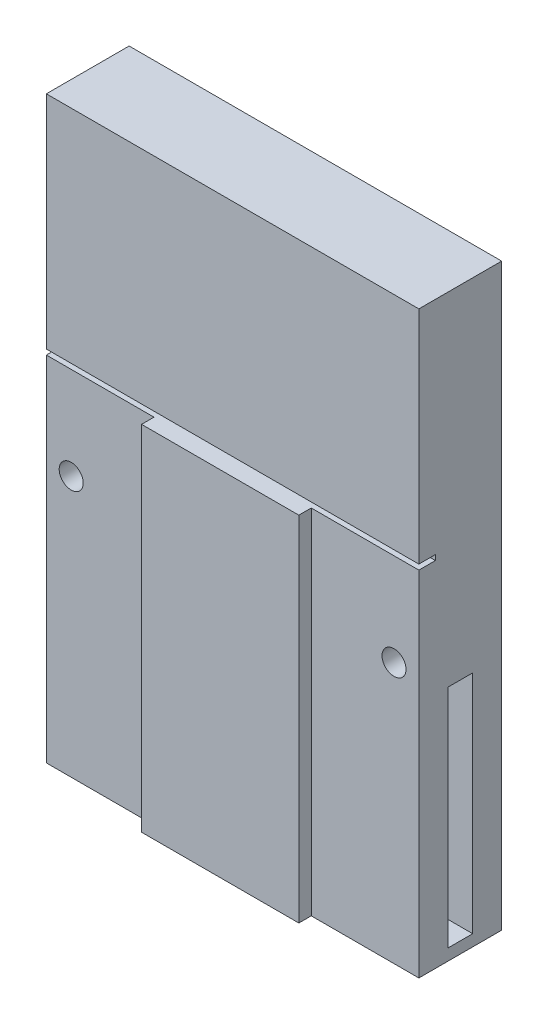
ISO-10303-21;
HEADER;
FILE_DESCRIPTION(('STEP AP214'),'2;1');
FILE_NAME('part.step','',(''),(''),'','','');
FILE_SCHEMA(('AUTOMOTIVE_DESIGN { 1 0 10303 214 1 1 1 1 }'));
ENDSEC;
DATA;
#1=APPLICATION_CONTEXT('core data for automotive mechanical design processes');
#2=APPLICATION_PROTOCOL_DEFINITION('international standard','automotive_design',2000,#1);
#3=PRODUCT_CONTEXT('',#1,'mechanical');
#4=PRODUCT('Part','Part','',(#3));
#5=PRODUCT_RELATED_PRODUCT_CATEGORY('part','',(#4));
#6=PRODUCT_DEFINITION_FORMATION('','',#4);
#7=PRODUCT_DEFINITION_CONTEXT('part definition',#1,'design');
#8=PRODUCT_DEFINITION('design','',#6,#7);
#9=PRODUCT_DEFINITION_SHAPE('','',#8);
#10=(LENGTH_UNIT() NAMED_UNIT(*) SI_UNIT(.MILLI.,.METRE.));
#11=(NAMED_UNIT(*) PLANE_ANGLE_UNIT() SI_UNIT($,.RADIAN.));
#12=(NAMED_UNIT(*) SI_UNIT($,.STERADIAN.) SOLID_ANGLE_UNIT());
#13=UNCERTAINTY_MEASURE_WITH_UNIT(LENGTH_MEASURE(1.E-05),#10,'distance_accuracy_value','');
#14=(GEOMETRIC_REPRESENTATION_CONTEXT(3) GLOBAL_UNCERTAINTY_ASSIGNED_CONTEXT((#13)) GLOBAL_UNIT_ASSIGNED_CONTEXT((#10,
#11,#12)) REPRESENTATION_CONTEXT('',''));
#15=CARTESIAN_POINT('',(0.,0.,0.));
#16=DIRECTION('',(0.,0.,1.));
#17=DIRECTION('',(1.,0.,0.));
#18=AXIS2_PLACEMENT_3D('',#15,#16,#17);
#19=CARTESIAN_POINT('',(-22.5,40.,-4.99999999999999));
#20=DIRECTION('',(1.,0.,0.));
#21=DIRECTION('',(0.,0.,-1.));
#22=AXIS2_PLACEMENT_3D('',#19,#20,#21);
#23=PLANE('',#22);
#24=DIRECTION('',(0.,-1.,0.));
#25=VECTOR('',#24,1.);
#26=CARTESIAN_POINT('',(-22.5,23.2974929319475,3.));
#27=LINE('',#26,#25);
#28=CARTESIAN_POINT('',(-22.5,23.2974929319475,3.));
#29=VERTEX_POINT('',#28);
#30=CARTESIAN_POINT('',(-22.5,22.6713275749144,3.));
#31=VERTEX_POINT('',#30);
#32=EDGE_CURVE('E270',#29,#31,#27,.T.);
#33=ORIENTED_EDGE('',*,*,#32,.F.);
#34=DIRECTION('',(0.,0.,1.));
#35=VECTOR('',#34,1.);
#36=CARTESIAN_POINT('',(-22.5,23.2974929319475,3.));
#37=LINE('',#36,#35);
#38=CARTESIAN_POINT('',(-22.5,23.2974929319475,5.));
#39=VERTEX_POINT('',#38);
#40=EDGE_CURVE('E286',#29,#39,#37,.T.);
#41=ORIENTED_EDGE('',*,*,#40,.T.);
#42=DIRECTION('',(0.,-1.,0.));
#43=VECTOR('',#42,1.);
#44=CARTESIAN_POINT('',(-22.5,40.,5.00000000000001));
#45=LINE('',#44,#43);
#46=CARTESIAN_POINT('',(-22.5,50.,5.));
#47=VERTEX_POINT('',#46);
#48=EDGE_CURVE('E11',#47,#39,#45,.T.);
#49=ORIENTED_EDGE('',*,*,#48,.F.);
#50=DIRECTION('',(0.,0.,1.));
#51=VECTOR('',#50,1.);
#52=CARTESIAN_POINT('',(-22.5,50.,-4.99999999999999));
#53=LINE('',#52,#51);
#54=CARTESIAN_POINT('',(-22.5,50.,-4.99999999999999));
#55=VERTEX_POINT('',#54);
#56=EDGE_CURVE('E315',#55,#47,#53,.T.);
#57=ORIENTED_EDGE('',*,*,#56,.F.);
#58=DIRECTION('',(0.,-1.,0.));
#59=VECTOR('',#58,1.);
#60=CARTESIAN_POINT('',(-22.5,40.,-4.99999999999999));
#61=LINE('',#60,#59);
#62=CARTESIAN_POINT('',(-22.5,-20.,-5.));
#63=VERTEX_POINT('',#62);
#64=EDGE_CURVE('E327',#55,#63,#61,.T.);
#65=ORIENTED_EDGE('',*,*,#64,.T.);
#66=DIRECTION('',(0.,0.,-1.));
#67=VECTOR('',#66,1.);
#68=CARTESIAN_POINT('',(-22.5,-20.,5.00000000000001));
#69=LINE('',#68,#67);
#70=CARTESIAN_POINT('',(-22.5,-20.,5.00000000000001));
#71=VERTEX_POINT('',#70);
#72=EDGE_CURVE('E302',#71,#63,#69,.T.);
#73=ORIENTED_EDGE('',*,*,#72,.F.);
#74=CARTESIAN_POINT('',(-22.5,22.6713275749144,5.));
#75=VERTEX_POINT('',#74);
#76=EDGE_CURVE('E48',#75,#71,#45,.T.);
#77=ORIENTED_EDGE('',*,*,#76,.F.);
#78=DIRECTION('',(0.,0.,1.));
#79=VECTOR('',#78,1.);
#80=CARTESIAN_POINT('',(-22.5,22.6713275749144,3.));
#81=LINE('',#80,#79);
#82=EDGE_CURVE('E281',#31,#75,#81,.T.);
#83=ORIENTED_EDGE('',*,*,#82,.F.);
#84=EDGE_LOOP('',(#33,#41,#49,#57,#65,#73,#77,#83));
#85=FACE_BOUND('',#84,.T.);
#86=DIRECTION('',(0.,-1.,0.));
#87=VECTOR('',#86,1.);
#88=CARTESIAN_POINT('',(-22.5,8.67132757491439,1.5));
#89=LINE('',#88,#87);
#90=CARTESIAN_POINT('',(-22.5,8.67132757491439,1.5));
#91=VERTEX_POINT('',#90);
#92=CARTESIAN_POINT('',(-22.5,-18.6150080325972,1.5));
#93=VERTEX_POINT('',#92);
#94=EDGE_CURVE('E56',#91,#93,#89,.T.);
#95=ORIENTED_EDGE('',*,*,#94,.T.);
#96=DIRECTION('',(0.,0.,-1.));
#97=VECTOR('',#96,1.);
#98=CARTESIAN_POINT('',(-22.5,-18.6150080325972,1.5));
#99=LINE('',#98,#97);
#100=CARTESIAN_POINT('',(-22.5,-18.6150080325972,-1.5));
#101=VERTEX_POINT('',#100);
#102=EDGE_CURVE('E198',#93,#101,#99,.T.);
#103=ORIENTED_EDGE('',*,*,#102,.T.);
#104=DIRECTION('',(0.,1.,0.));
#105=VECTOR('',#104,1.);
#106=CARTESIAN_POINT('',(-22.5,8.67132757491439,-1.5));
#107=LINE('',#106,#105);
#108=CARTESIAN_POINT('',(-22.5,8.67132757491439,-1.5));
#109=VERTEX_POINT('',#108);
#110=EDGE_CURVE('E201',#101,#109,#107,.T.);
#111=ORIENTED_EDGE('',*,*,#110,.T.);
#112=DIRECTION('',(0.,0.,1.));
#113=VECTOR('',#112,1.);
#114=CARTESIAN_POINT('',(-22.5,8.67132757491439,1.5));
#115=LINE('',#114,#113);
#116=EDGE_CURVE('E207',#109,#91,#115,.T.);
#117=ORIENTED_EDGE('',*,*,#116,.T.);
#118=EDGE_LOOP('',(#95,#103,#111,#117));
#119=FACE_BOUND('',#118,.T.);
#120=ADVANCED_FACE('F40',(#85,#119),#23,.F.);
#121=CARTESIAN_POINT('',(22.5,40.,5.));
#122=DIRECTION('',(0.,0.,-1.));
#123=DIRECTION('',(-1.,0.,0.));
#124=AXIS2_PLACEMENT_3D('',#121,#122,#123);
#125=PLANE('',#124);
#126=CARTESIAN_POINT('',(-19.5,11.5,5.));
#127=DIRECTION('',(0.,0.,1.));
#128=DIRECTION('',(1.,0.,0.));
#129=AXIS2_PLACEMENT_3D('',#126,#127,#128);
#130=CIRCLE('',#129,1.45);
#131=CARTESIAN_POINT('',(-18.05,11.5,5.));
#132=VERTEX_POINT('',#131);
#133=EDGE_CURVE('E289',#132,#132,#130,.T.);
#134=ORIENTED_EDGE('',*,*,#133,.F.);
#135=EDGE_LOOP('',(#134));
#136=FACE_BOUND('',#135,.T.);
#137=DIRECTION('',(0.,-1.,0.));
#138=VECTOR('',#137,1.);
#139=CARTESIAN_POINT('',(-9.50000000000001,22.6713275749144,5.));
#140=LINE('',#139,#138);
#141=CARTESIAN_POINT('',(-9.50000000000001,22.6713275749144,5.));
#142=VERTEX_POINT('',#141);
#143=CARTESIAN_POINT('',(-9.5,-20.,5.));
#144=VERTEX_POINT('',#143);
#145=EDGE_CURVE('E241',#142,#144,#140,.T.);
#146=ORIENTED_EDGE('',*,*,#145,.F.);
#147=DIRECTION('',(1.,0.,0.));
#148=VECTOR('',#147,1.);
#149=CARTESIAN_POINT('',(-22.5,22.6713275749144,5.));
#150=LINE('',#149,#148);
#151=EDGE_CURVE('E282',#75,#142,#150,.T.);
#152=ORIENTED_EDGE('',*,*,#151,.F.);
#153=ORIENTED_EDGE('',*,*,#76,.T.);
#154=DIRECTION('',(-1.,0.,0.));
#155=VECTOR('',#154,1.);
#156=CARTESIAN_POINT('',(-22.5,-20.,5.00000000000001));
#157=LINE('',#156,#155);
#158=EDGE_CURVE('E311',#144,#71,#157,.T.);
#159=ORIENTED_EDGE('',*,*,#158,.F.);
#160=EDGE_LOOP('',(#146,#152,#153,#159));
#161=FACE_BOUND('',#160,.T.);
#162=ADVANCED_FACE('F361',(#136,#161),#125,.F.);
#163=CARTESIAN_POINT('',(19.5,11.5,5.));
#164=DIRECTION('',(0.,0.,1.));
#165=DIRECTION('',(1.,0.,0.));
#166=AXIS2_PLACEMENT_3D('',#163,#164,#165);
#167=CIRCLE('',#166,1.45);
#168=CARTESIAN_POINT('',(20.95,11.5,5.));
#169=VERTEX_POINT('',#168);
#170=EDGE_CURVE('E296',#169,#169,#167,.T.);
#171=ORIENTED_EDGE('',*,*,#170,.F.);
#172=EDGE_LOOP('',(#171));
#173=FACE_BOUND('',#172,.T.);
#174=DIRECTION('',(0.,1.,0.));
#175=VECTOR('',#174,1.);
#176=CARTESIAN_POINT('',(9.49999999999999,22.6713275749144,5.));
#177=LINE('',#176,#175);
#178=CARTESIAN_POINT('',(9.5,-20.,5.));
#179=VERTEX_POINT('',#178);
#180=CARTESIAN_POINT('',(9.49999999999998,22.6713275749144,5.));
#181=VERTEX_POINT('',#180);
#182=EDGE_CURVE('E251',#179,#181,#177,.T.);
#183=ORIENTED_EDGE('',*,*,#182,.F.);
#184=CARTESIAN_POINT('',(22.5,-20.,5.00000000000001));
#185=VERTEX_POINT('',#184);
#186=EDGE_CURVE('E312',#185,#179,#157,.T.);
#187=ORIENTED_EDGE('',*,*,#186,.F.);
#188=DIRECTION('',(0.,-1.,0.));
#189=VECTOR('',#188,1.);
#190=CARTESIAN_POINT('',(22.5,40.,5.));
#191=LINE('',#190,#189);
#192=CARTESIAN_POINT('',(22.5,22.6713275749144,5.));
#193=VERTEX_POINT('',#192);
#194=EDGE_CURVE('E331',#193,#185,#191,.T.);
#195=ORIENTED_EDGE('',*,*,#194,.F.);
#196=EDGE_CURVE('E269',#181,#193,#150,.T.);
#197=ORIENTED_EDGE('',*,*,#196,.F.);
#198=EDGE_LOOP('',(#183,#187,#195,#197));
#199=FACE_BOUND('',#198,.T.);
#200=ADVANCED_FACE('F368',(#173,#199),#125,.F.);
#201=ORIENTED_EDGE('',*,*,#48,.T.);
#202=DIRECTION('',(-1.,0.,0.));
#203=VECTOR('',#202,1.);
#204=CARTESIAN_POINT('',(-22.5,23.2974929319475,5.));
#205=LINE('',#204,#203);
#206=CARTESIAN_POINT('',(22.5,23.2974929319475,5.));
#207=VERTEX_POINT('',#206);
#208=EDGE_CURVE('E274',#207,#39,#205,.T.);
#209=ORIENTED_EDGE('',*,*,#208,.F.);
#210=CARTESIAN_POINT('',(22.5,50.,5.));
#211=VERTEX_POINT('',#210);
#212=EDGE_CURVE('E332',#211,#207,#191,.T.);
#213=ORIENTED_EDGE('',*,*,#212,.F.);
#214=DIRECTION('',(1.,0.,0.));
#215=VECTOR('',#214,1.);
#216=CARTESIAN_POINT('',(-22.5,50.,5.));
#217=LINE('',#216,#215);
#218=EDGE_CURVE('E318',#47,#211,#217,.T.);
#219=ORIENTED_EDGE('',*,*,#218,.F.);
#220=EDGE_LOOP('',(#201,#209,#213,#219));
#221=FACE_BOUND('',#220,.T.);
#222=ADVANCED_FACE('F370',(#221),#125,.F.);
#223=CARTESIAN_POINT('',(22.5,40.,-5.));
#224=DIRECTION('',(-1.,0.,0.));
#225=DIRECTION('',(0.,0.,1.));
#226=AXIS2_PLACEMENT_3D('',#223,#224,#225);
#227=PLANE('',#226);
#228=DIRECTION('',(0.,0.,-1.));
#229=VECTOR('',#228,1.);
#230=CARTESIAN_POINT('',(22.5,-18.6150080325972,1.5));
#231=LINE('',#230,#229);
#232=CARTESIAN_POINT('',(22.5,-18.6150080325973,1.5));
#233=VERTEX_POINT('',#232);
#234=CARTESIAN_POINT('',(22.5,-18.6150080325972,-1.5));
#235=VERTEX_POINT('',#234);
#236=EDGE_CURVE('E231',#233,#235,#231,.T.);
#237=ORIENTED_EDGE('',*,*,#236,.F.);
#238=DIRECTION('',(0.,-1.,0.));
#239=VECTOR('',#238,1.);
#240=CARTESIAN_POINT('',(22.5,8.67132757491439,1.5));
#241=LINE('',#240,#239);
#242=CARTESIAN_POINT('',(22.5,8.67132757491439,1.5));
#243=VERTEX_POINT('',#242);
#244=EDGE_CURVE('E64',#243,#233,#241,.T.);
#245=ORIENTED_EDGE('',*,*,#244,.F.);
#246=DIRECTION('',(0.,0.,1.));
#247=VECTOR('',#246,1.);
#248=CARTESIAN_POINT('',(22.5,8.67132757491439,1.5));
#249=LINE('',#248,#247);
#250=CARTESIAN_POINT('',(22.5,8.67132757491439,-1.5));
#251=VERTEX_POINT('',#250);
#252=EDGE_CURVE('E220',#251,#243,#249,.T.);
#253=ORIENTED_EDGE('',*,*,#252,.F.);
#254=DIRECTION('',(0.,1.,0.));
#255=VECTOR('',#254,1.);
#256=CARTESIAN_POINT('',(22.5,8.67132757491439,-1.5));
#257=LINE('',#256,#255);
#258=EDGE_CURVE('E234',#235,#251,#257,.T.);
#259=ORIENTED_EDGE('',*,*,#258,.F.);
#260=EDGE_LOOP('',(#237,#245,#253,#259));
#261=FACE_BOUND('',#260,.T.);
#262=ORIENTED_EDGE('',*,*,#212,.T.);
#263=DIRECTION('',(0.,0.,1.));
#264=VECTOR('',#263,1.);
#265=CARTESIAN_POINT('',(22.5,23.2974929319475,3.));
#266=LINE('',#265,#264);
#267=CARTESIAN_POINT('',(22.5,23.2974929319475,3.));
#268=VERTEX_POINT('',#267);
#269=EDGE_CURVE('E290',#268,#207,#266,.T.);
#270=ORIENTED_EDGE('',*,*,#269,.F.);
#271=DIRECTION('',(0.,1.,0.));
#272=VECTOR('',#271,1.);
#273=CARTESIAN_POINT('',(22.5,23.2974929319475,3.));
#274=LINE('',#273,#272);
#275=CARTESIAN_POINT('',(22.5,22.6713275749144,3.));
#276=VERTEX_POINT('',#275);
#277=EDGE_CURVE('E276',#276,#268,#274,.T.);
#278=ORIENTED_EDGE('',*,*,#277,.F.);
#279=DIRECTION('',(0.,0.,1.));
#280=VECTOR('',#279,1.);
#281=CARTESIAN_POINT('',(22.5,22.6713275749144,3.));
#282=LINE('',#281,#280);
#283=EDGE_CURVE('E292',#276,#193,#282,.T.);
#284=ORIENTED_EDGE('',*,*,#283,.T.);
#285=ORIENTED_EDGE('',*,*,#194,.T.);
#286=DIRECTION('',(0.,0.,1.));
#287=VECTOR('',#286,1.);
#288=CARTESIAN_POINT('',(22.5,-20.,5.00000000000001));
#289=LINE('',#288,#287);
#290=CARTESIAN_POINT('',(22.5,-20.,-5.));
#291=VERTEX_POINT('',#290);
#292=EDGE_CURVE('E308',#291,#185,#289,.T.);
#293=ORIENTED_EDGE('',*,*,#292,.F.);
#294=DIRECTION('',(0.,-1.,0.));
#295=VECTOR('',#294,1.);
#296=CARTESIAN_POINT('',(22.5,40.,-5.));
#297=LINE('',#296,#295);
#298=CARTESIAN_POINT('',(22.5,50.,-4.99999999999999));
#299=VERTEX_POINT('',#298);
#300=EDGE_CURVE('E329',#299,#291,#297,.T.);
#301=ORIENTED_EDGE('',*,*,#300,.F.);
#302=DIRECTION('',(0.,0.,-1.));
#303=VECTOR('',#302,1.);
#304=CARTESIAN_POINT('',(22.5,50.,-4.99999999999999));
#305=LINE('',#304,#303);
#306=EDGE_CURVE('E321',#211,#299,#305,.T.);
#307=ORIENTED_EDGE('',*,*,#306,.F.);
#308=EDGE_LOOP('',(#262,#270,#278,#284,#285,#293,#301,#307));
#309=FACE_BOUND('',#308,.T.);
#310=ADVANCED_FACE('F454',(#261,#309),#227,.F.);
#311=CARTESIAN_POINT('',(22.5,40.,-5.));
#312=DIRECTION('',(0.,0.,1.));
#313=DIRECTION('',(1.,0.,0.));
#314=AXIS2_PLACEMENT_3D('',#311,#312,#313);
#315=PLANE('',#314);
#316=CARTESIAN_POINT('',(19.5,11.5,-5.));
#317=DIRECTION('',(0.,0.,1.));
#318=DIRECTION('',(1.,0.,0.));
#319=AXIS2_PLACEMENT_3D('',#316,#317,#318);
#320=CIRCLE('',#319,1.45);
#321=CARTESIAN_POINT('',(20.95,11.5,-5.));
#322=VERTEX_POINT('',#321);
#323=EDGE_CURVE('E43',#322,#322,#320,.T.);
#324=ORIENTED_EDGE('',*,*,#323,.T.);
#325=EDGE_LOOP('',(#324));
#326=FACE_BOUND('',#325,.T.);
#327=CARTESIAN_POINT('',(-19.5,11.5,-4.99999999999999));
#328=DIRECTION('',(0.,0.,1.));
#329=DIRECTION('',(1.,0.,0.));
#330=AXIS2_PLACEMENT_3D('',#327,#328,#329);
#331=CIRCLE('',#330,1.45);
#332=CARTESIAN_POINT('',(-18.05,11.5,-4.99999999999999));
#333=VERTEX_POINT('',#332);
#334=EDGE_CURVE('E299',#333,#333,#331,.T.);
#335=ORIENTED_EDGE('',*,*,#334,.T.);
#336=EDGE_LOOP('',(#335));
#337=FACE_BOUND('',#336,.T.);
#338=ORIENTED_EDGE('',*,*,#300,.T.);
#339=DIRECTION('',(1.,0.,0.));
#340=VECTOR('',#339,1.);
#341=CARTESIAN_POINT('',(-22.5,-20.,-5.));
#342=LINE('',#341,#340);
#343=EDGE_CURVE('E305',#63,#291,#342,.T.);
#344=ORIENTED_EDGE('',*,*,#343,.F.);
#345=ORIENTED_EDGE('',*,*,#64,.F.);
#346=DIRECTION('',(-1.,0.,0.));
#347=VECTOR('',#346,1.);
#348=CARTESIAN_POINT('',(-22.5,50.,-4.99999999999999));
#349=LINE('',#348,#347);
#350=EDGE_CURVE('E324',#299,#55,#349,.T.);
#351=ORIENTED_EDGE('',*,*,#350,.F.);
#352=EDGE_LOOP('',(#338,#344,#345,#351));
#353=FACE_BOUND('',#352,.T.);
#354=ADVANCED_FACE('F340',(#326,#337,#353),#315,.F.);
#355=CARTESIAN_POINT('',(0.,50.,0.));
#356=DIRECTION('',(0.,1.,0.));
#357=DIRECTION('',(0.,0.,1.));
#358=AXIS2_PLACEMENT_3D('',#355,#356,#357);
#359=PLANE('',#358);
#360=ORIENTED_EDGE('',*,*,#56,.T.);
#361=ORIENTED_EDGE('',*,*,#218,.T.);
#362=ORIENTED_EDGE('',*,*,#306,.T.);
#363=ORIENTED_EDGE('',*,*,#350,.T.);
#364=EDGE_LOOP('',(#360,#361,#362,#363));
#365=FACE_BOUND('',#364,.T.);
#366=ADVANCED_FACE('F463',(#365),#359,.T.);
#367=CARTESIAN_POINT('',(0.,-20.,0.));
#368=DIRECTION('',(0.,-1.,0.));
#369=DIRECTION('',(0.,0.,-1.));
#370=AXIS2_PLACEMENT_3D('',#367,#368,#369);
#371=PLANE('',#370);
#372=ORIENTED_EDGE('',*,*,#72,.T.);
#373=ORIENTED_EDGE('',*,*,#343,.T.);
#374=ORIENTED_EDGE('',*,*,#292,.T.);
#375=ORIENTED_EDGE('',*,*,#186,.T.);
#376=DIRECTION('',(0.,0.,-1.));
#377=VECTOR('',#376,1.);
#378=CARTESIAN_POINT('',(9.5,-20.,6.5));
#379=LINE('',#378,#377);
#380=CARTESIAN_POINT('',(9.5,-20.,6.5));
#381=VERTEX_POINT('',#380);
#382=EDGE_CURVE('E265',#381,#179,#379,.T.);
#383=ORIENTED_EDGE('',*,*,#382,.F.);
#384=DIRECTION('',(1.,0.,0.));
#385=VECTOR('',#384,1.);
#386=CARTESIAN_POINT('',(-9.5,-20.,6.5));
#387=LINE('',#386,#385);
#388=CARTESIAN_POINT('',(-9.5,-20.,6.5));
#389=VERTEX_POINT('',#388);
#390=EDGE_CURVE('E250',#389,#381,#387,.T.);
#391=ORIENTED_EDGE('',*,*,#390,.F.);
#392=DIRECTION('',(0.,0.,-1.));
#393=VECTOR('',#392,1.);
#394=CARTESIAN_POINT('',(-9.5,-20.,6.5));
#395=LINE('',#394,#393);
#396=EDGE_CURVE('E267',#389,#144,#395,.T.);
#397=ORIENTED_EDGE('',*,*,#396,.T.);
#398=ORIENTED_EDGE('',*,*,#158,.T.);
#399=EDGE_LOOP('',(#372,#373,#374,#375,#383,#391,#397,#398));
#400=FACE_BOUND('',#399,.T.);
#401=ADVANCED_FACE('F356',(#400),#371,.T.);
#402=CARTESIAN_POINT('',(-19.5,11.5,-15.));
#403=DIRECTION('',(0.,0.,1.));
#404=DIRECTION('',(1.,0.,0.));
#405=AXIS2_PLACEMENT_3D('',#402,#403,#404);
#406=CYLINDRICAL_SURFACE('',#405,1.45);
#407=ORIENTED_EDGE('',*,*,#133,.T.);
#408=EDGE_LOOP('',(#407));
#409=FACE_BOUND('',#408,.T.);
#410=ORIENTED_EDGE('',*,*,#334,.F.);
#411=EDGE_LOOP('',(#410));
#412=FACE_BOUND('',#411,.T.);
#413=ADVANCED_FACE('F345',(#409,#412),#406,.F.);
#414=CARTESIAN_POINT('',(19.5,11.5,-15.));
#415=DIRECTION('',(0.,0.,1.));
#416=DIRECTION('',(1.,0.,0.));
#417=AXIS2_PLACEMENT_3D('',#414,#415,#416);
#418=CYLINDRICAL_SURFACE('',#417,1.45);
#419=ORIENTED_EDGE('',*,*,#170,.T.);
#420=EDGE_LOOP('',(#419));
#421=FACE_BOUND('',#420,.T.);
#422=ORIENTED_EDGE('',*,*,#323,.F.);
#423=EDGE_LOOP('',(#422));
#424=FACE_BOUND('',#423,.T.);
#425=ADVANCED_FACE('F342',(#421,#424),#418,.F.);
#426=CARTESIAN_POINT('',(-22.5,23.2974929319475,3.));
#427=DIRECTION('',(0.,1.,0.));
#428=DIRECTION('',(0.,0.,1.));
#429=AXIS2_PLACEMENT_3D('',#426,#427,#428);
#430=PLANE('',#429);
#431=ORIENTED_EDGE('',*,*,#208,.T.);
#432=ORIENTED_EDGE('',*,*,#40,.F.);
#433=DIRECTION('',(-1.,0.,0.));
#434=VECTOR('',#433,1.);
#435=CARTESIAN_POINT('',(-22.5,23.2974929319475,3.));
#436=LINE('',#435,#434);
#437=EDGE_CURVE('E278',#268,#29,#436,.T.);
#438=ORIENTED_EDGE('',*,*,#437,.F.);
#439=ORIENTED_EDGE('',*,*,#269,.T.);
#440=EDGE_LOOP('',(#431,#432,#438,#439));
#441=FACE_BOUND('',#440,.T.);
#442=ADVANCED_FACE('F344',(#441),#430,.F.);
#443=CARTESIAN_POINT('',(-22.5,22.6713275749144,3.));
#444=DIRECTION('',(0.,-1.,0.));
#445=DIRECTION('',(0.,0.,-1.));
#446=AXIS2_PLACEMENT_3D('',#443,#444,#445);
#447=PLANE('',#446);
#448=ORIENTED_EDGE('',*,*,#151,.T.);
#449=DIRECTION('',(0.,0.,-1.));
#450=VECTOR('',#449,1.);
#451=CARTESIAN_POINT('',(-9.50000000000001,22.6713275749144,6.5));
#452=LINE('',#451,#450);
#453=CARTESIAN_POINT('',(-9.50000000000001,22.6713275749144,6.5));
#454=VERTEX_POINT('',#453);
#455=EDGE_CURVE('E257',#454,#142,#452,.T.);
#456=ORIENTED_EDGE('',*,*,#455,.F.);
#457=DIRECTION('',(-1.,0.,0.));
#458=VECTOR('',#457,1.);
#459=CARTESIAN_POINT('',(-9.50000000000001,22.6713275749144,6.5));
#460=LINE('',#459,#458);
#461=CARTESIAN_POINT('',(9.49999999999999,22.6713275749144,6.5));
#462=VERTEX_POINT('',#461);
#463=EDGE_CURVE('E255',#462,#454,#460,.T.);
#464=ORIENTED_EDGE('',*,*,#463,.F.);
#465=DIRECTION('',(0.,0.,-1.));
#466=VECTOR('',#465,1.);
#467=CARTESIAN_POINT('',(9.49999999999999,22.6713275749144,6.5));
#468=LINE('',#467,#466);
#469=EDGE_CURVE('E263',#462,#181,#468,.T.);
#470=ORIENTED_EDGE('',*,*,#469,.T.);
#471=ORIENTED_EDGE('',*,*,#196,.T.);
#472=ORIENTED_EDGE('',*,*,#283,.F.);
#473=DIRECTION('',(1.,0.,0.));
#474=VECTOR('',#473,1.);
#475=CARTESIAN_POINT('',(-22.5,22.6713275749144,3.));
#476=LINE('',#475,#474);
#477=EDGE_CURVE('E273',#31,#276,#476,.T.);
#478=ORIENTED_EDGE('',*,*,#477,.F.);
#479=ORIENTED_EDGE('',*,*,#82,.T.);
#480=EDGE_LOOP('',(#448,#456,#464,#470,#471,#472,#478,#479));
#481=FACE_BOUND('',#480,.T.);
#482=ADVANCED_FACE('F353',(#481),#447,.F.);
#483=CARTESIAN_POINT('',(0.,0.,3.));
#484=DIRECTION('',(0.,0.,1.));
#485=DIRECTION('',(1.,0.,0.));
#486=AXIS2_PLACEMENT_3D('',#483,#484,#485);
#487=PLANE('',#486);
#488=ORIENTED_EDGE('',*,*,#32,.T.);
#489=ORIENTED_EDGE('',*,*,#477,.T.);
#490=ORIENTED_EDGE('',*,*,#277,.T.);
#491=ORIENTED_EDGE('',*,*,#437,.T.);
#492=EDGE_LOOP('',(#488,#489,#490,#491));
#493=FACE_BOUND('',#492,.T.);
#494=ADVANCED_FACE('F420',(#493),#487,.T.);
#495=CARTESIAN_POINT('',(-9.50000000000001,22.6713275749144,6.5));
#496=DIRECTION('',(1.,0.,0.));
#497=DIRECTION('',(0.,1.,0.));
#498=AXIS2_PLACEMENT_3D('',#495,#496,#497);
#499=PLANE('',#498);
#500=ORIENTED_EDGE('',*,*,#145,.T.);
#501=ORIENTED_EDGE('',*,*,#396,.F.);
#502=DIRECTION('',(0.,-1.,0.));
#503=VECTOR('',#502,1.);
#504=CARTESIAN_POINT('',(-9.50000000000001,22.6713275749144,6.5));
#505=LINE('',#504,#503);
#506=EDGE_CURVE('E247',#454,#389,#505,.T.);
#507=ORIENTED_EDGE('',*,*,#506,.F.);
#508=ORIENTED_EDGE('',*,*,#455,.T.);
#509=EDGE_LOOP('',(#500,#501,#507,#508));
#510=FACE_BOUND('',#509,.T.);
#511=ADVANCED_FACE('F416',(#510),#499,.F.);
#512=CARTESIAN_POINT('',(9.49999999999999,22.6713275749144,6.5));
#513=DIRECTION('',(-1.,0.,0.));
#514=DIRECTION('',(0.,-1.,0.));
#515=AXIS2_PLACEMENT_3D('',#512,#513,#514);
#516=PLANE('',#515);
#517=ORIENTED_EDGE('',*,*,#182,.T.);
#518=ORIENTED_EDGE('',*,*,#469,.F.);
#519=DIRECTION('',(0.,1.,0.));
#520=VECTOR('',#519,1.);
#521=CARTESIAN_POINT('',(9.49999999999999,22.6713275749144,6.5));
#522=LINE('',#521,#520);
#523=EDGE_CURVE('E253',#381,#462,#522,.T.);
#524=ORIENTED_EDGE('',*,*,#523,.F.);
#525=ORIENTED_EDGE('',*,*,#382,.T.);
#526=EDGE_LOOP('',(#517,#518,#524,#525));
#527=FACE_BOUND('',#526,.T.);
#528=ADVANCED_FACE('F412',(#527),#516,.F.);
#529=CARTESIAN_POINT('',(0.,0.,6.5));
#530=DIRECTION('',(0.,0.,1.));
#531=DIRECTION('',(1.,0.,0.));
#532=AXIS2_PLACEMENT_3D('',#529,#530,#531);
#533=PLANE('',#532);
#534=ORIENTED_EDGE('',*,*,#506,.T.);
#535=ORIENTED_EDGE('',*,*,#390,.T.);
#536=ORIENTED_EDGE('',*,*,#523,.T.);
#537=ORIENTED_EDGE('',*,*,#463,.T.);
#538=EDGE_LOOP('',(#534,#535,#536,#537));
#539=FACE_BOUND('',#538,.T.);
#540=ADVANCED_FACE('F409',(#539),#533,.T.);
#541=CARTESIAN_POINT('',(12.5,8.67132757491439,1.5));
#542=DIRECTION('',(0.,0.,1.));
#543=DIRECTION('',(1.,0.,0.));
#544=AXIS2_PLACEMENT_3D('',#541,#542,#543);
#545=PLANE('',#544);
#546=ORIENTED_EDGE('',*,*,#244,.T.);
#547=DIRECTION('',(1.,0.,0.));
#548=VECTOR('',#547,1.);
#549=CARTESIAN_POINT('',(12.5,-18.6150080325972,1.5));
#550=LINE('',#549,#548);
#551=CARTESIAN_POINT('',(12.5,-18.6150080325972,1.5));
#552=VERTEX_POINT('',#551);
#553=EDGE_CURVE('E229',#552,#233,#550,.T.);
#554=ORIENTED_EDGE('',*,*,#553,.F.);
#555=DIRECTION('',(0.,-1.,0.));
#556=VECTOR('',#555,1.);
#557=CARTESIAN_POINT('',(12.5,8.67132757491439,1.5));
#558=LINE('',#557,#556);
#559=CARTESIAN_POINT('',(12.5,8.67132757491439,1.5));
#560=VERTEX_POINT('',#559);
#561=EDGE_CURVE('E216',#560,#552,#558,.T.);
#562=ORIENTED_EDGE('',*,*,#561,.F.);
#563=DIRECTION('',(1.,0.,0.));
#564=VECTOR('',#563,1.);
#565=CARTESIAN_POINT('',(12.5,8.67132757491439,1.5));
#566=LINE('',#565,#564);
#567=EDGE_CURVE('E239',#560,#243,#566,.T.);
#568=ORIENTED_EDGE('',*,*,#567,.T.);
#569=EDGE_LOOP('',(#546,#554,#562,#568));
#570=FACE_BOUND('',#569,.T.);
#571=ADVANCED_FACE('F399',(#570),#545,.F.);
#572=CARTESIAN_POINT('',(12.5,8.67132757491439,1.5));
#573=DIRECTION('',(0.,1.,0.));
#574=DIRECTION('',(0.,0.,1.));
#575=AXIS2_PLACEMENT_3D('',#572,#573,#574);
#576=PLANE('',#575);
#577=ORIENTED_EDGE('',*,*,#252,.T.);
#578=ORIENTED_EDGE('',*,*,#567,.F.);
#579=DIRECTION('',(0.,0.,1.));
#580=VECTOR('',#579,1.);
#581=CARTESIAN_POINT('',(12.5,8.67132757491439,1.5));
#582=LINE('',#581,#580);
#583=CARTESIAN_POINT('',(12.5,8.67132757491439,-1.5));
#584=VERTEX_POINT('',#583);
#585=EDGE_CURVE('E226',#584,#560,#582,.T.);
#586=ORIENTED_EDGE('',*,*,#585,.F.);
#587=DIRECTION('',(1.,0.,0.));
#588=VECTOR('',#587,1.);
#589=CARTESIAN_POINT('',(12.5,8.67132757491439,-1.5));
#590=LINE('',#589,#588);
#591=EDGE_CURVE('E242',#584,#251,#590,.T.);
#592=ORIENTED_EDGE('',*,*,#591,.T.);
#593=EDGE_LOOP('',(#577,#578,#586,#592));
#594=FACE_BOUND('',#593,.T.);
#595=ADVANCED_FACE('F395',(#594),#576,.F.);
#596=CARTESIAN_POINT('',(12.5,8.67132757491439,-1.5));
#597=DIRECTION('',(0.,0.,-1.));
#598=DIRECTION('',(-1.,0.,0.));
#599=AXIS2_PLACEMENT_3D('',#596,#597,#598);
#600=PLANE('',#599);
#601=ORIENTED_EDGE('',*,*,#258,.T.);
#602=ORIENTED_EDGE('',*,*,#591,.F.);
#603=DIRECTION('',(0.,1.,0.));
#604=VECTOR('',#603,1.);
#605=CARTESIAN_POINT('',(12.5,8.67132757491439,-1.5));
#606=LINE('',#605,#604);
#607=CARTESIAN_POINT('',(12.5,-18.6150080325972,-1.5));
#608=VERTEX_POINT('',#607);
#609=EDGE_CURVE('E223',#608,#584,#606,.T.);
#610=ORIENTED_EDGE('',*,*,#609,.F.);
#611=DIRECTION('',(1.,0.,0.));
#612=VECTOR('',#611,1.);
#613=CARTESIAN_POINT('',(12.5,-18.6150080325972,-1.5));
#614=LINE('',#613,#612);
#615=EDGE_CURVE('E244',#608,#235,#614,.T.);
#616=ORIENTED_EDGE('',*,*,#615,.T.);
#617=EDGE_LOOP('',(#601,#602,#610,#616));
#618=FACE_BOUND('',#617,.T.);
#619=ADVANCED_FACE('F398',(#618),#600,.F.);
#620=CARTESIAN_POINT('',(12.5,-18.6150080325972,1.5));
#621=DIRECTION('',(0.,-1.,0.));
#622=DIRECTION('',(0.,0.,-1.));
#623=AXIS2_PLACEMENT_3D('',#620,#621,#622);
#624=PLANE('',#623);
#625=ORIENTED_EDGE('',*,*,#236,.T.);
#626=ORIENTED_EDGE('',*,*,#615,.F.);
#627=DIRECTION('',(0.,0.,-1.));
#628=VECTOR('',#627,1.);
#629=CARTESIAN_POINT('',(12.5,-18.6150080325972,1.5));
#630=LINE('',#629,#628);
#631=EDGE_CURVE('E219',#552,#608,#630,.T.);
#632=ORIENTED_EDGE('',*,*,#631,.F.);
#633=ORIENTED_EDGE('',*,*,#553,.T.);
#634=EDGE_LOOP('',(#625,#626,#632,#633));
#635=FACE_BOUND('',#634,.T.);
#636=ADVANCED_FACE('F393',(#635),#624,.F.);
#637=CARTESIAN_POINT('',(12.5,0.,0.));
#638=DIRECTION('',(1.,0.,0.));
#639=DIRECTION('',(0.,0.,-1.));
#640=AXIS2_PLACEMENT_3D('',#637,#638,#639);
#641=PLANE('',#640);
#642=ORIENTED_EDGE('',*,*,#561,.T.);
#643=ORIENTED_EDGE('',*,*,#631,.T.);
#644=ORIENTED_EDGE('',*,*,#609,.T.);
#645=ORIENTED_EDGE('',*,*,#585,.T.);
#646=EDGE_LOOP('',(#642,#643,#644,#645));
#647=FACE_BOUND('',#646,.T.);
#648=ADVANCED_FACE('F386',(#647),#641,.T.);
#649=CARTESIAN_POINT('',(-12.5,8.67132757491439,1.5));
#650=DIRECTION('',(0.,0.,-1.));
#651=DIRECTION('',(-1.,0.,0.));
#652=AXIS2_PLACEMENT_3D('',#649,#650,#651);
#653=PLANE('',#652);
#654=ORIENTED_EDGE('',*,*,#94,.F.);
#655=DIRECTION('',(-1.,0.,0.));
#656=VECTOR('',#655,1.);
#657=CARTESIAN_POINT('',(-12.5,8.67132757491439,1.5));
#658=LINE('',#657,#656);
#659=CARTESIAN_POINT('',(-12.5,8.67132757491439,1.5));
#660=VERTEX_POINT('',#659);
#661=EDGE_CURVE('E183',#660,#91,#658,.T.);
#662=ORIENTED_EDGE('',*,*,#661,.F.);
#663=DIRECTION('',(0.,-1.,0.));
#664=VECTOR('',#663,1.);
#665=CARTESIAN_POINT('',(-12.5,8.67132757491439,1.5));
#666=LINE('',#665,#664);
#667=CARTESIAN_POINT('',(-12.5,-18.6150080325972,1.5));
#668=VERTEX_POINT('',#667);
#669=EDGE_CURVE('E190',#660,#668,#666,.T.);
#670=ORIENTED_EDGE('',*,*,#669,.T.);
#671=DIRECTION('',(-1.,0.,0.));
#672=VECTOR('',#671,1.);
#673=CARTESIAN_POINT('',(-12.5,-18.6150080325972,1.5));
#674=LINE('',#673,#672);
#675=EDGE_CURVE('E211',#668,#93,#674,.T.);
#676=ORIENTED_EDGE('',*,*,#675,.T.);
#677=EDGE_LOOP('',(#654,#662,#670,#676));
#678=FACE_BOUND('',#677,.T.);
#679=ADVANCED_FACE('F193',(#678),#653,.T.);
#680=CARTESIAN_POINT('',(-12.5,-18.6150080325972,1.5));
#681=DIRECTION('',(0.,1.,0.));
#682=DIRECTION('',(0.,0.,1.));
#683=AXIS2_PLACEMENT_3D('',#680,#681,#682);
#684=PLANE('',#683);
#685=ORIENTED_EDGE('',*,*,#102,.F.);
#686=ORIENTED_EDGE('',*,*,#675,.F.);
#687=DIRECTION('',(0.,0.,-1.));
#688=VECTOR('',#687,1.);
#689=CARTESIAN_POINT('',(-12.5,-18.6150080325972,1.5));
#690=LINE('',#689,#688);
#691=CARTESIAN_POINT('',(-12.5,-18.6150080325972,-1.5));
#692=VERTEX_POINT('',#691);
#693=EDGE_CURVE('E195',#668,#692,#690,.T.);
#694=ORIENTED_EDGE('',*,*,#693,.T.);
#695=DIRECTION('',(-1.,0.,0.));
#696=VECTOR('',#695,1.);
#697=CARTESIAN_POINT('',(-12.5,-18.6150080325972,-1.5));
#698=LINE('',#697,#696);
#699=EDGE_CURVE('E213',#692,#101,#698,.T.);
#700=ORIENTED_EDGE('',*,*,#699,.T.);
#701=EDGE_LOOP('',(#685,#686,#694,#700));
#702=FACE_BOUND('',#701,.T.);
#703=ADVANCED_FACE('F379',(#702),#684,.T.);
#704=CARTESIAN_POINT('',(-12.5,8.67132757491439,-1.5));
#705=DIRECTION('',(0.,0.,1.));
#706=DIRECTION('',(1.,0.,0.));
#707=AXIS2_PLACEMENT_3D('',#704,#705,#706);
#708=PLANE('',#707);
#709=ORIENTED_EDGE('',*,*,#110,.F.);
#710=ORIENTED_EDGE('',*,*,#699,.F.);
#711=DIRECTION('',(0.,1.,0.));
#712=VECTOR('',#711,1.);
#713=CARTESIAN_POINT('',(-12.5,8.67132757491439,-1.5));
#714=LINE('',#713,#712);
#715=CARTESIAN_POINT('',(-12.5,8.67132757491439,-1.5));
#716=VERTEX_POINT('',#715);
#717=EDGE_CURVE('E189',#692,#716,#714,.T.);
#718=ORIENTED_EDGE('',*,*,#717,.T.);
#719=DIRECTION('',(-1.,0.,0.));
#720=VECTOR('',#719,1.);
#721=CARTESIAN_POINT('',(-12.5,8.67132757491439,-1.5));
#722=LINE('',#721,#720);
#723=EDGE_CURVE('E185',#716,#109,#722,.T.);
#724=ORIENTED_EDGE('',*,*,#723,.T.);
#725=EDGE_LOOP('',(#709,#710,#718,#724));
#726=FACE_BOUND('',#725,.T.);
#727=ADVANCED_FACE('F377',(#726),#708,.T.);
#728=CARTESIAN_POINT('',(-12.5,8.67132757491439,1.5));
#729=DIRECTION('',(0.,-1.,0.));
#730=DIRECTION('',(0.,0.,-1.));
#731=AXIS2_PLACEMENT_3D('',#728,#729,#730);
#732=PLANE('',#731);
#733=ORIENTED_EDGE('',*,*,#116,.F.);
#734=ORIENTED_EDGE('',*,*,#723,.F.);
#735=DIRECTION('',(0.,0.,1.));
#736=VECTOR('',#735,1.);
#737=CARTESIAN_POINT('',(-12.5,8.67132757491439,1.5));
#738=LINE('',#737,#736);
#739=EDGE_CURVE('E180',#716,#660,#738,.T.);
#740=ORIENTED_EDGE('',*,*,#739,.T.);
#741=ORIENTED_EDGE('',*,*,#661,.T.);
#742=EDGE_LOOP('',(#733,#734,#740,#741));
#743=FACE_BOUND('',#742,.T.);
#744=ADVANCED_FACE('F182',(#743),#732,.T.);
#745=CARTESIAN_POINT('',(-12.5,0.,0.));
#746=DIRECTION('',(-1.,0.,0.));
#747=DIRECTION('',(0.,0.,-1.));
#748=AXIS2_PLACEMENT_3D('',#745,#746,#747);
#749=PLANE('',#748);
#750=ORIENTED_EDGE('',*,*,#669,.F.);
#751=ORIENTED_EDGE('',*,*,#739,.F.);
#752=ORIENTED_EDGE('',*,*,#717,.F.);
#753=ORIENTED_EDGE('',*,*,#693,.F.);
#754=EDGE_LOOP('',(#750,#751,#752,#753));
#755=FACE_BOUND('',#754,.T.);
#756=ADVANCED_FACE('F197',(#755),#749,.T.);
#757=CLOSED_SHELL('',(#120,#162,#200,#222,#310,#354,#366,#401,#413,#425,#442,#482,#494,#511,
#528,#540,#571,#595,#619,#636,#648,#679,#703,#727,#744,#756));
#758=MANIFOLD_SOLID_BREP('B2',#757);
#759=ADVANCED_BREP_SHAPE_REPRESENTATION('',(#18,#758),#14);
#760=SHAPE_DEFINITION_REPRESENTATION(#9,#759);
ENDSEC;
END-ISO-10303-21;
